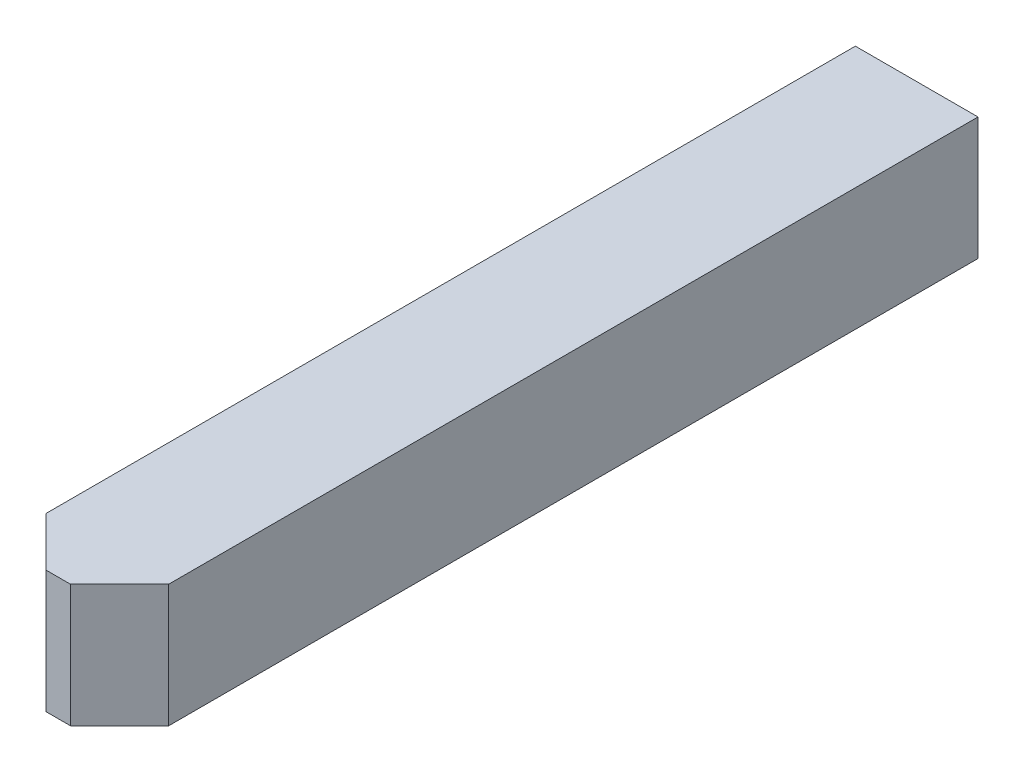
ISO-10303-21;
HEADER;
FILE_DESCRIPTION(('STEP AP214'),'2;1');
FILE_NAME('part.step','',(''),(''),'','','');
FILE_SCHEMA(('AUTOMOTIVE_DESIGN { 1 0 10303 214 1 1 1 1 }'));
ENDSEC;
DATA;
#1=APPLICATION_CONTEXT('core data for automotive mechanical design processes');
#2=APPLICATION_PROTOCOL_DEFINITION('international standard','automotive_design',2000,#1);
#3=PRODUCT_CONTEXT('',#1,'mechanical');
#4=PRODUCT('Part','Part','',(#3));
#5=PRODUCT_RELATED_PRODUCT_CATEGORY('part','',(#4));
#6=PRODUCT_DEFINITION_FORMATION('','',#4);
#7=PRODUCT_DEFINITION_CONTEXT('part definition',#1,'design');
#8=PRODUCT_DEFINITION('design','',#6,#7);
#9=PRODUCT_DEFINITION_SHAPE('','',#8);
#10=(LENGTH_UNIT() NAMED_UNIT(*) SI_UNIT(.MILLI.,.METRE.));
#11=(NAMED_UNIT(*) PLANE_ANGLE_UNIT() SI_UNIT($,.RADIAN.));
#12=(NAMED_UNIT(*) SI_UNIT($,.STERADIAN.) SOLID_ANGLE_UNIT());
#13=UNCERTAINTY_MEASURE_WITH_UNIT(LENGTH_MEASURE(1.E-05),#10,'distance_accuracy_value','');
#14=(GEOMETRIC_REPRESENTATION_CONTEXT(3) GLOBAL_UNCERTAINTY_ASSIGNED_CONTEXT((#13)) GLOBAL_UNIT_ASSIGNED_CONTEXT((#10,
#11,#12)) REPRESENTATION_CONTEXT('',''));
#15=CARTESIAN_POINT('',(0.,0.,0.));
#16=DIRECTION('',(0.,0.,1.));
#17=DIRECTION('',(1.,0.,0.));
#18=AXIS2_PLACEMENT_3D('',#15,#16,#17);
#19=CARTESIAN_POINT('',(0.5,0.5,0.));
#20=DIRECTION('',(0.,1.,0.));
#21=DIRECTION('',(0.,0.,1.));
#22=AXIS2_PLACEMENT_3D('',#19,#20,#21);
#23=PLANE('',#22);
#24=DIRECTION('',(0.,0.,1.));
#25=VECTOR('',#24,1.);
#26=CARTESIAN_POINT('',(-8.,0.5,0.));
#27=LINE('',#26,#25);
#28=CARTESIAN_POINT('',(-8.,0.5,3.3));
#29=VERTEX_POINT('',#28);
#30=CARTESIAN_POINT('',(-8.,0.5,0.));
#31=VERTEX_POINT('',#30);
#32=EDGE_CURVE('E84',#29,#31,#27,.F.);
#33=ORIENTED_EDGE('',*,*,#32,.F.);
#34=DIRECTION('',(0.707106781186548,0.,0.707106781186547));
#35=VECTOR('',#34,1.);
#36=CARTESIAN_POINT('',(-8.,0.5,3.3));
#37=LINE('',#36,#35);
#38=CARTESIAN_POINT('',(-7.8,0.5,3.5));
#39=VERTEX_POINT('',#38);
#40=EDGE_CURVE('E76',#29,#39,#37,.T.);
#41=ORIENTED_EDGE('',*,*,#40,.T.);
#42=DIRECTION('',(1.,0.,0.));
#43=VECTOR('',#42,1.);
#44=CARTESIAN_POINT('',(0.5,0.5,3.5));
#45=LINE('',#44,#43);
#46=CARTESIAN_POINT('',(-7.7,0.5,3.5));
#47=VERTEX_POINT('',#46);
#48=EDGE_CURVE('E19',#39,#47,#45,.T.);
#49=ORIENTED_EDGE('',*,*,#48,.T.);
#50=DIRECTION('',(0.707106781186548,0.,-0.707106781186547));
#51=VECTOR('',#50,1.);
#52=CARTESIAN_POINT('',(-7.7,0.5,3.5));
#53=LINE('',#52,#51);
#54=CARTESIAN_POINT('',(-7.5,0.5,3.3));
#55=VERTEX_POINT('',#54);
#56=EDGE_CURVE('E68',#47,#55,#53,.T.);
#57=ORIENTED_EDGE('',*,*,#56,.T.);
#58=DIRECTION('',(0.,0.,-1.));
#59=VECTOR('',#58,1.);
#60=CARTESIAN_POINT('',(-7.5,0.5,0.));
#61=LINE('',#60,#59);
#62=CARTESIAN_POINT('',(-7.5,0.5,0.));
#63=VERTEX_POINT('',#62);
#64=EDGE_CURVE('E98',#63,#55,#61,.F.);
#65=ORIENTED_EDGE('',*,*,#64,.F.);
#66=DIRECTION('',(1.,0.,0.));
#67=VECTOR('',#66,1.);
#68=CARTESIAN_POINT('',(0.,0.5,0.));
#69=LINE('',#68,#67);
#70=EDGE_CURVE('E89',#63,#31,#69,.F.);
#71=ORIENTED_EDGE('',*,*,#70,.T.);
#72=EDGE_LOOP('',(#33,#41,#49,#57,#65,#71));
#73=FACE_BOUND('',#72,.T.);
#74=ADVANCED_FACE('F16',(#73),#23,.T.);
#75=CARTESIAN_POINT('',(-8.,0.5,0.));
#76=DIRECTION('',(-1.,0.,0.));
#77=DIRECTION('',(0.,0.,1.));
#78=AXIS2_PLACEMENT_3D('',#75,#76,#77);
#79=PLANE('',#78);
#80=DIRECTION('',(0.,0.,-1.));
#81=VECTOR('',#80,1.);
#82=CARTESIAN_POINT('',(-8.,0.,0.));
#83=LINE('',#82,#81);
#84=CARTESIAN_POINT('',(-8.,0.,3.3));
#85=VERTEX_POINT('',#84);
#86=CARTESIAN_POINT('',(-8.,0.,0.));
#87=VERTEX_POINT('',#86);
#88=EDGE_CURVE('E104',#85,#87,#83,.T.);
#89=ORIENTED_EDGE('',*,*,#88,.F.);
#90=DIRECTION('',(0.,1.,0.));
#91=VECTOR('',#90,1.);
#92=CARTESIAN_POINT('',(-8.,0.6,3.3));
#93=LINE('',#92,#91);
#94=EDGE_CURVE('E102',#29,#85,#93,.F.);
#95=ORIENTED_EDGE('',*,*,#94,.F.);
#96=ORIENTED_EDGE('',*,*,#32,.T.);
#97=DIRECTION('',(0.,1.,0.));
#98=VECTOR('',#97,1.);
#99=CARTESIAN_POINT('',(-8.,0.,0.));
#100=LINE('',#99,#98);
#101=EDGE_CURVE('E93',#31,#87,#100,.F.);
#102=ORIENTED_EDGE('',*,*,#101,.T.);
#103=EDGE_LOOP('',(#89,#95,#96,#102));
#104=FACE_BOUND('',#103,.T.);
#105=ADVANCED_FACE('F124',(#104),#79,.T.);
#106=CARTESIAN_POINT('',(0.,0.,0.));
#107=DIRECTION('',(0.,0.,1.));
#108=DIRECTION('',(1.,0.,0.));
#109=AXIS2_PLACEMENT_3D('',#106,#107,#108);
#110=PLANE('',#109);
#111=ORIENTED_EDGE('',*,*,#70,.F.);
#112=DIRECTION('',(0.,1.,0.));
#113=VECTOR('',#112,1.);
#114=CARTESIAN_POINT('',(-7.5,0.,0.));
#115=LINE('',#114,#113);
#116=CARTESIAN_POINT('',(-7.5,0.,0.));
#117=VERTEX_POINT('',#116);
#118=EDGE_CURVE('E95',#117,#63,#115,.T.);
#119=ORIENTED_EDGE('',*,*,#118,.F.);
#120=DIRECTION('',(1.,0.,0.));
#121=VECTOR('',#120,1.);
#122=CARTESIAN_POINT('',(0.,0.,0.));
#123=LINE('',#122,#121);
#124=EDGE_CURVE('E107',#87,#117,#123,.T.);
#125=ORIENTED_EDGE('',*,*,#124,.F.);
#126=ORIENTED_EDGE('',*,*,#101,.F.);
#127=EDGE_LOOP('',(#111,#119,#125,#126));
#128=FACE_BOUND('',#127,.T.);
#129=ADVANCED_FACE('F125',(#128),#110,.F.);
#130=CARTESIAN_POINT('',(-7.5,0.,0.));
#131=DIRECTION('',(1.,0.,0.));
#132=DIRECTION('',(0.,0.,-1.));
#133=AXIS2_PLACEMENT_3D('',#130,#131,#132);
#134=PLANE('',#133);
#135=ORIENTED_EDGE('',*,*,#64,.T.);
#136=DIRECTION('',(0.,1.,0.));
#137=VECTOR('',#136,1.);
#138=CARTESIAN_POINT('',(-7.5,-0.1,3.3));
#139=LINE('',#138,#137);
#140=CARTESIAN_POINT('',(-7.5,0.,3.3));
#141=VERTEX_POINT('',#140);
#142=EDGE_CURVE('E72',#141,#55,#139,.T.);
#143=ORIENTED_EDGE('',*,*,#142,.F.);
#144=DIRECTION('',(0.,0.,-1.));
#145=VECTOR('',#144,1.);
#146=CARTESIAN_POINT('',(-7.5,0.,0.));
#147=LINE('',#146,#145);
#148=EDGE_CURVE('E110',#117,#141,#147,.F.);
#149=ORIENTED_EDGE('',*,*,#148,.F.);
#150=ORIENTED_EDGE('',*,*,#118,.T.);
#151=EDGE_LOOP('',(#135,#143,#149,#150));
#152=FACE_BOUND('',#151,.T.);
#153=ADVANCED_FACE('F120',(#152),#134,.T.);
#154=CARTESIAN_POINT('',(-7.5,-0.1,3.3));
#155=DIRECTION('',(0.707106781186548,0.,0.707106781186548));
#156=DIRECTION('',(0.707106781186548,0.,-0.707106781186548));
#157=AXIS2_PLACEMENT_3D('',#154,#155,#156);
#158=PLANE('',#157);
#159=DIRECTION('',(-0.707106781186548,0.,0.707106781186547));
#160=VECTOR('',#159,1.);
#161=CARTESIAN_POINT('',(-7.5,0.,3.3));
#162=LINE('',#161,#160);
#163=CARTESIAN_POINT('',(-7.7,0.,3.5));
#164=VERTEX_POINT('',#163);
#165=EDGE_CURVE('E113',#141,#164,#162,.T.);
#166=ORIENTED_EDGE('',*,*,#165,.F.);
#167=ORIENTED_EDGE('',*,*,#142,.T.);
#168=ORIENTED_EDGE('',*,*,#56,.F.);
#169=DIRECTION('',(0.,1.,0.));
#170=VECTOR('',#169,1.);
#171=CARTESIAN_POINT('',(-7.7,0.,3.5));
#172=LINE('',#171,#170);
#173=EDGE_CURVE('E71',#164,#47,#172,.T.);
#174=ORIENTED_EDGE('',*,*,#173,.F.);
#175=EDGE_LOOP('',(#166,#167,#168,#174));
#176=FACE_BOUND('',#175,.T.);
#177=ADVANCED_FACE('F70',(#176),#158,.T.);
#178=CARTESIAN_POINT('',(0.,0.,3.5));
#179=DIRECTION('',(0.,0.,1.));
#180=DIRECTION('',(1.,0.,0.));
#181=AXIS2_PLACEMENT_3D('',#178,#179,#180);
#182=PLANE('',#181);
#183=ORIENTED_EDGE('',*,*,#48,.F.);
#184=DIRECTION('',(0.,1.,0.));
#185=VECTOR('',#184,1.);
#186=CARTESIAN_POINT('',(-7.8,0.6,3.5));
#187=LINE('',#186,#185);
#188=CARTESIAN_POINT('',(-7.8,0.,3.5));
#189=VERTEX_POINT('',#188);
#190=EDGE_CURVE('E34',#189,#39,#187,.T.);
#191=ORIENTED_EDGE('',*,*,#190,.F.);
#192=DIRECTION('',(1.,0.,0.));
#193=VECTOR('',#192,1.);
#194=CARTESIAN_POINT('',(0.,0.,3.5));
#195=LINE('',#194,#193);
#196=EDGE_CURVE('E25',#164,#189,#195,.F.);
#197=ORIENTED_EDGE('',*,*,#196,.F.);
#198=ORIENTED_EDGE('',*,*,#173,.T.);
#199=EDGE_LOOP('',(#183,#191,#197,#198));
#200=FACE_BOUND('',#199,.T.);
#201=ADVANCED_FACE('F77',(#200),#182,.T.);
#202=CARTESIAN_POINT('',(-8.,0.6,3.3));
#203=DIRECTION('',(-0.707106781186548,0.,0.707106781186548));
#204=DIRECTION('',(0.707106781186548,0.,0.707106781186548));
#205=AXIS2_PLACEMENT_3D('',#202,#203,#204);
#206=PLANE('',#205);
#207=ORIENTED_EDGE('',*,*,#40,.F.);
#208=ORIENTED_EDGE('',*,*,#94,.T.);
#209=DIRECTION('',(-0.707106781186548,0.,-0.707106781186547));
#210=VECTOR('',#209,1.);
#211=CARTESIAN_POINT('',(-7.8,0.,3.5));
#212=LINE('',#211,#210);
#213=EDGE_CURVE('E11',#189,#85,#212,.T.);
#214=ORIENTED_EDGE('',*,*,#213,.F.);
#215=ORIENTED_EDGE('',*,*,#190,.T.);
#216=EDGE_LOOP('',(#207,#208,#214,#215));
#217=FACE_BOUND('',#216,.T.);
#218=ADVANCED_FACE('F126',(#217),#206,.T.);
#219=CARTESIAN_POINT('',(0.,0.,0.));
#220=DIRECTION('',(0.,-1.,0.));
#221=DIRECTION('',(0.,0.,-1.));
#222=AXIS2_PLACEMENT_3D('',#219,#220,#221);
#223=PLANE('',#222);
#224=ORIENTED_EDGE('',*,*,#196,.T.);
#225=ORIENTED_EDGE('',*,*,#213,.T.);
#226=ORIENTED_EDGE('',*,*,#88,.T.);
#227=ORIENTED_EDGE('',*,*,#124,.T.);
#228=ORIENTED_EDGE('',*,*,#148,.T.);
#229=ORIENTED_EDGE('',*,*,#165,.T.);
#230=EDGE_LOOP('',(#224,#225,#226,#227,#228,#229));
#231=FACE_BOUND('',#230,.T.);
#232=ADVANCED_FACE('F116',(#231),#223,.T.);
#233=CLOSED_SHELL('',(#74,#105,#129,#153,#177,#201,#218,#232));
#234=MANIFOLD_SOLID_BREP('B1',#233);
#235=ADVANCED_BREP_SHAPE_REPRESENTATION('',(#18,#234),#14);
#236=SHAPE_DEFINITION_REPRESENTATION(#9,#235);
ENDSEC;
END-ISO-10303-21;
